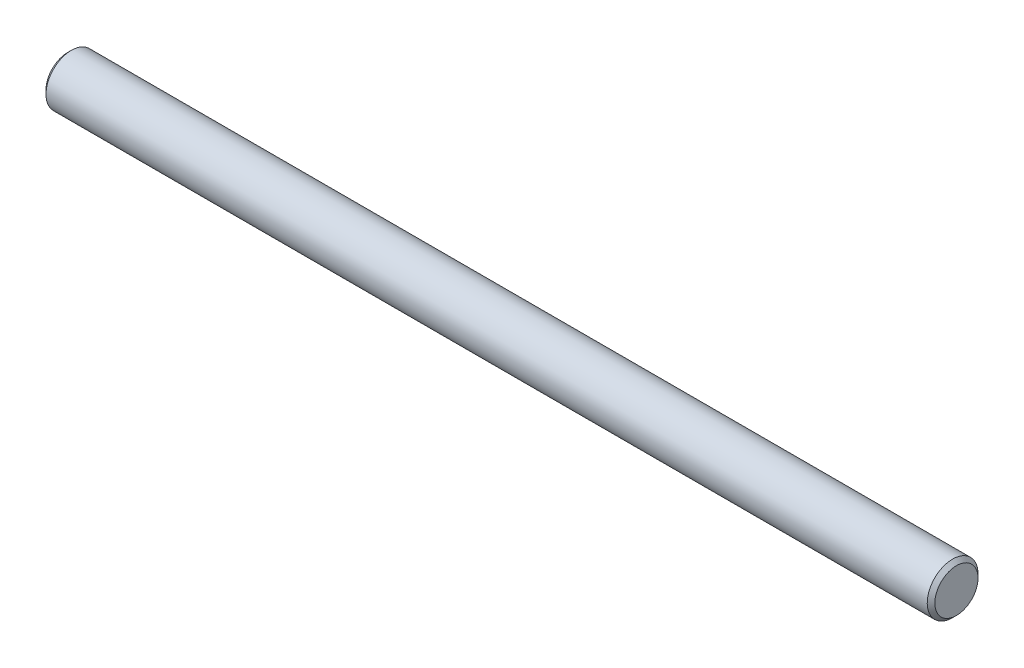
ISO-10303-21;
HEADER;
FILE_DESCRIPTION(('STEP AP214'),'2;1');
FILE_NAME('part.step','',(''),(''),'','','');
FILE_SCHEMA(('AUTOMOTIVE_DESIGN { 1 0 10303 214 1 1 1 1 }'));
ENDSEC;
DATA;
#1=APPLICATION_CONTEXT('core data for automotive mechanical design processes');
#2=APPLICATION_PROTOCOL_DEFINITION('international standard','automotive_design',2000,#1);
#3=PRODUCT_CONTEXT('',#1,'mechanical');
#4=PRODUCT('Part','Part','',(#3));
#5=PRODUCT_RELATED_PRODUCT_CATEGORY('part','',(#4));
#6=PRODUCT_DEFINITION_FORMATION('','',#4);
#7=PRODUCT_DEFINITION_CONTEXT('part definition',#1,'design');
#8=PRODUCT_DEFINITION('design','',#6,#7);
#9=PRODUCT_DEFINITION_SHAPE('','',#8);
#10=(LENGTH_UNIT() NAMED_UNIT(*) SI_UNIT(.MILLI.,.METRE.));
#11=(NAMED_UNIT(*) PLANE_ANGLE_UNIT() SI_UNIT($,.RADIAN.));
#12=(NAMED_UNIT(*) SI_UNIT($,.STERADIAN.) SOLID_ANGLE_UNIT());
#13=UNCERTAINTY_MEASURE_WITH_UNIT(LENGTH_MEASURE(1.E-05),#10,'distance_accuracy_value','');
#14=(GEOMETRIC_REPRESENTATION_CONTEXT(3) GLOBAL_UNCERTAINTY_ASSIGNED_CONTEXT((#13)) GLOBAL_UNIT_ASSIGNED_CONTEXT((#10,
#11,#12)) REPRESENTATION_CONTEXT('',''));
#15=CARTESIAN_POINT('',(0.,0.,0.));
#16=DIRECTION('',(0.,0.,1.));
#17=DIRECTION('',(1.,0.,0.));
#18=AXIS2_PLACEMENT_3D('',#15,#16,#17);
#19=CARTESIAN_POINT('',(0.,1.69999999999999,0.));
#20=DIRECTION('',(1.,0.,0.));
#21=DIRECTION('',(0.,1.,0.));
#22=AXIS2_PLACEMENT_3D('',#19,#20,#21);
#23=PLANE('',#22);
#24=CARTESIAN_POINT('',(0.,0.,0.));
#25=DIRECTION('',(1.,0.,0.));
#26=DIRECTION('',(0.,1.,0.));
#27=AXIS2_PLACEMENT_3D('',#24,#25,#26);
#28=CIRCLE('',#27,1.69999999999999);
#29=CARTESIAN_POINT('',(0.,1.69999999999999,0.));
#30=VERTEX_POINT('',#29);
#31=EDGE_CURVE('E44',#30,#30,#28,.T.);
#32=ORIENTED_EDGE('',*,*,#31,.T.);
#33=EDGE_LOOP('',(#32));
#34=FACE_BOUND('',#33,.T.);
#35=ADVANCED_FACE('F30',(#34),#23,.T.);
#36=CARTESIAN_POINT('',(-70.,0.,0.));
#37=DIRECTION('',(-1.,0.,0.));
#38=DIRECTION('',(0.,-1.,0.));
#39=AXIS2_PLACEMENT_3D('',#36,#37,#38);
#40=PLANE('',#39);
#41=CARTESIAN_POINT('',(-70.,0.,0.));
#42=DIRECTION('',(1.,0.,0.));
#43=DIRECTION('',(0.,1.,0.));
#44=AXIS2_PLACEMENT_3D('',#41,#42,#43);
#45=CIRCLE('',#44,1.7);
#46=CARTESIAN_POINT('',(-70.,1.69999999999999,0.));
#47=VERTEX_POINT('',#46);
#48=EDGE_CURVE('E10',#47,#47,#45,.T.);
#49=ORIENTED_EDGE('',*,*,#48,.F.);
#50=EDGE_LOOP('',(#49));
#51=FACE_BOUND('',#50,.T.);
#52=ADVANCED_FACE('F62',(#51),#40,.T.);
#53=CARTESIAN_POINT('',(-69.7,0.,0.));
#54=DIRECTION('',(1.,0.,0.));
#55=DIRECTION('',(0.,1.,0.));
#56=AXIS2_PLACEMENT_3D('',#53,#54,#55);
#57=CONICAL_SURFACE('',#56,2.,0.785398163397457);
#58=ORIENTED_EDGE('',*,*,#48,.T.);
#59=EDGE_LOOP('',(#58));
#60=FACE_BOUND('',#59,.T.);
#61=CARTESIAN_POINT('',(-69.7,0.,0.));
#62=DIRECTION('',(1.,0.,0.));
#63=DIRECTION('',(0.,1.,0.));
#64=AXIS2_PLACEMENT_3D('',#61,#62,#63);
#65=CIRCLE('',#64,2.);
#66=CARTESIAN_POINT('',(-69.7,1.99999999999999,0.));
#67=VERTEX_POINT('',#66);
#68=EDGE_CURVE('E36',#67,#67,#65,.T.);
#69=ORIENTED_EDGE('',*,*,#68,.F.);
#70=EDGE_LOOP('',(#69));
#71=FACE_BOUND('',#70,.T.);
#72=ADVANCED_FACE('F59',(#60,#71),#57,.T.);
#73=CARTESIAN_POINT('',(0.,0.,0.));
#74=DIRECTION('',(1.,0.,0.));
#75=DIRECTION('',(0.,1.,0.));
#76=AXIS2_PLACEMENT_3D('',#73,#74,#75);
#77=CYLINDRICAL_SURFACE('',#76,2.);
#78=ORIENTED_EDGE('',*,*,#68,.T.);
#79=EDGE_LOOP('',(#78));
#80=FACE_BOUND('',#79,.T.);
#81=CARTESIAN_POINT('',(-0.299999999999999,0.,0.));
#82=DIRECTION('',(1.,0.,0.));
#83=DIRECTION('',(0.,1.,0.));
#84=AXIS2_PLACEMENT_3D('',#81,#82,#83);
#85=CIRCLE('',#84,1.99999999999999);
#86=CARTESIAN_POINT('',(-0.299999999999999,1.99999999999999,0.));
#87=VERTEX_POINT('',#86);
#88=EDGE_CURVE('E40',#87,#87,#85,.T.);
#89=ORIENTED_EDGE('',*,*,#88,.F.);
#90=EDGE_LOOP('',(#89));
#91=FACE_BOUND('',#90,.T.);
#92=ADVANCED_FACE('F53',(#80,#91),#77,.T.);
#93=CARTESIAN_POINT('',(0.,0.,0.));
#94=DIRECTION('',(-1.,0.,0.));
#95=DIRECTION('',(0.,-1.,0.));
#96=AXIS2_PLACEMENT_3D('',#93,#94,#95);
#97=CONICAL_SURFACE('',#96,1.69999999999999,0.78539816339745);
#98=ORIENTED_EDGE('',*,*,#88,.T.);
#99=EDGE_LOOP('',(#98));
#100=FACE_BOUND('',#99,.T.);
#101=ORIENTED_EDGE('',*,*,#31,.F.);
#102=EDGE_LOOP('',(#101));
#103=FACE_BOUND('',#102,.T.);
#104=ADVANCED_FACE('F51',(#100,#103),#97,.T.);
#105=CLOSED_SHELL('',(#35,#52,#72,#92,#104));
#106=MANIFOLD_SOLID_BREP('B2',#105);
#107=ADVANCED_BREP_SHAPE_REPRESENTATION('',(#18,#106),#14);
#108=SHAPE_DEFINITION_REPRESENTATION(#9,#107);
ENDSEC;
END-ISO-10303-21;
